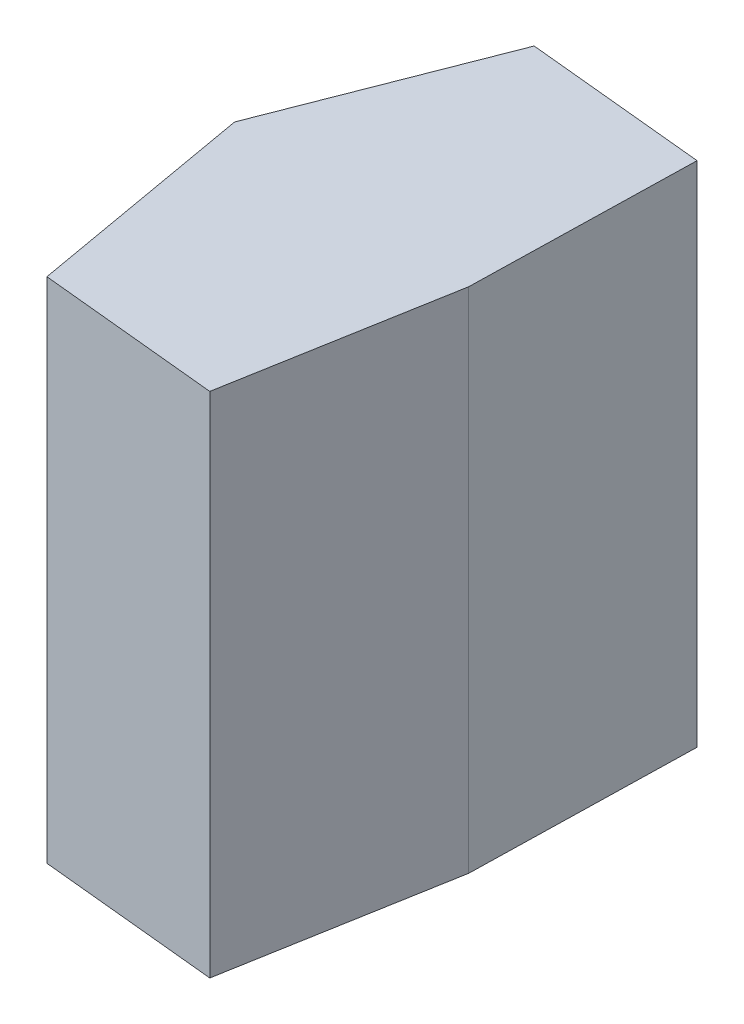
ISO-10303-21;
HEADER;
FILE_DESCRIPTION(('STEP AP214'),'2;1');
FILE_NAME('part.step','',(''),(''),'','','');
FILE_SCHEMA(('AUTOMOTIVE_DESIGN { 1 0 10303 214 1 1 1 1 }'));
ENDSEC;
DATA;
#1=APPLICATION_CONTEXT('core data for automotive mechanical design processes');
#2=APPLICATION_PROTOCOL_DEFINITION('international standard','automotive_design',2000,#1);
#3=PRODUCT_CONTEXT('',#1,'mechanical');
#4=PRODUCT('Part','Part','',(#3));
#5=PRODUCT_RELATED_PRODUCT_CATEGORY('part','',(#4));
#6=PRODUCT_DEFINITION_FORMATION('','',#4);
#7=PRODUCT_DEFINITION_CONTEXT('part definition',#1,'design');
#8=PRODUCT_DEFINITION('design','',#6,#7);
#9=PRODUCT_DEFINITION_SHAPE('','',#8);
#10=(LENGTH_UNIT() NAMED_UNIT(*) SI_UNIT(.MILLI.,.METRE.));
#11=(NAMED_UNIT(*) PLANE_ANGLE_UNIT() SI_UNIT($,.RADIAN.));
#12=(NAMED_UNIT(*) SI_UNIT($,.STERADIAN.) SOLID_ANGLE_UNIT());
#13=UNCERTAINTY_MEASURE_WITH_UNIT(LENGTH_MEASURE(1.E-05),#10,'distance_accuracy_value','');
#14=(GEOMETRIC_REPRESENTATION_CONTEXT(3) GLOBAL_UNCERTAINTY_ASSIGNED_CONTEXT((#13)) GLOBAL_UNIT_ASSIGNED_CONTEXT((#10,
#11,#12)) REPRESENTATION_CONTEXT('',''));
#15=CARTESIAN_POINT('',(0.,0.,0.));
#16=DIRECTION('',(0.,0.,1.));
#17=DIRECTION('',(1.,0.,0.));
#18=AXIS2_PLACEMENT_3D('',#15,#16,#17);
#19=CARTESIAN_POINT('',(2.27222589262074,6.5,-12.8864333948838));
#20=DIRECTION('',(-0.984807753012206,0.,-0.17364817766694));
#21=DIRECTION('',(-0.17364817766694,0.,0.984807753012206));
#22=AXIS2_PLACEMENT_3D('',#19,#20,#21);
#23=PLANE('',#22);
#24=DIRECTION('',(0.17364817766694,0.,-0.984807753012206));
#25=VECTOR('',#24,1.);
#26=CARTESIAN_POINT('',(2.27222589262074,-6.5,-12.8864333948838));
#27=LINE('',#26,#25);
#28=CARTESIAN_POINT('',(2.27222589262074,-6.5,-12.8864333948838));
#29=VERTEX_POINT('',#28);
#30=CARTESIAN_POINT('',(3.26526789961103,-6.5,-18.5182544752442));
#31=VERTEX_POINT('',#30);
#32=EDGE_CURVE('E134',#29,#31,#27,.T.);
#33=ORIENTED_EDGE('',*,*,#32,.T.);
#34=DIRECTION('',(0.,-1.,0.));
#35=VECTOR('',#34,1.);
#36=CARTESIAN_POINT('',(3.26526789961103,6.5,-18.5182544752442));
#37=LINE('',#36,#35);
#38=CARTESIAN_POINT('',(3.26526789961103,6.5,-18.5182544752442));
#39=VERTEX_POINT('',#38);
#40=EDGE_CURVE('E131',#39,#31,#37,.T.);
#41=ORIENTED_EDGE('',*,*,#40,.F.);
#42=DIRECTION('',(0.17364817766694,0.,-0.984807753012206));
#43=VECTOR('',#42,1.);
#44=CARTESIAN_POINT('',(2.27222589262074,6.5,-12.8864333948838));
#45=LINE('',#44,#43);
#46=CARTESIAN_POINT('',(2.27222589262074,6.5,-12.8864333948838));
#47=VERTEX_POINT('',#46);
#48=EDGE_CURVE('E79',#47,#39,#45,.T.);
#49=ORIENTED_EDGE('',*,*,#48,.F.);
#50=DIRECTION('',(0.,-1.,0.));
#51=VECTOR('',#50,1.);
#52=CARTESIAN_POINT('',(2.27222589262074,6.5,-12.8864333948838));
#53=LINE('',#52,#51);
#54=EDGE_CURVE('E47',#47,#29,#53,.T.);
#55=ORIENTED_EDGE('',*,*,#54,.T.);
#56=EDGE_LOOP('',(#33,#41,#49,#55));
#57=FACE_BOUND('',#56,.T.);
#58=ADVANCED_FACE('F39',(#57),#23,.F.);
#59=CARTESIAN_POINT('',(-3.3810821421355,6.5,-19.1750696833283));
#60=DIRECTION('',(0.98480775301221,0.,-0.17364817766692));
#61=DIRECTION('',(-0.17364817766692,0.,-0.98480775301221));
#62=AXIS2_PLACEMENT_3D('',#59,#60,#61);
#63=PLANE('',#62);
#64=DIRECTION('',(0.17364817766692,0.,0.98480775301221));
#65=VECTOR('',#64,1.);
#66=CARTESIAN_POINT('',(-3.3810821421355,-6.5,-19.1750696833283));
#67=LINE('',#66,#65);
#68=CARTESIAN_POINT('',(-3.3810821421355,-6.5,-19.1750696833283));
#69=VERTEX_POINT('',#68);
#70=CARTESIAN_POINT('',(-2.35294288432885,-6.5,-13.3442022024938));
#71=VERTEX_POINT('',#70);
#72=EDGE_CURVE('E69',#69,#71,#67,.T.);
#73=ORIENTED_EDGE('',*,*,#72,.T.);
#74=DIRECTION('',(0.,-1.,0.));
#75=VECTOR('',#74,1.);
#76=CARTESIAN_POINT('',(-2.35294288432885,6.5,-13.3442022024938));
#77=LINE('',#76,#75);
#78=CARTESIAN_POINT('',(-2.35294288432885,6.5,-13.3442022024938));
#79=VERTEX_POINT('',#78);
#80=EDGE_CURVE('E11',#79,#71,#77,.T.);
#81=ORIENTED_EDGE('',*,*,#80,.F.);
#82=DIRECTION('',(0.17364817766692,0.,0.98480775301221));
#83=VECTOR('',#82,1.);
#84=CARTESIAN_POINT('',(-3.3810821421355,6.5,-19.1750696833283));
#85=LINE('',#84,#83);
#86=CARTESIAN_POINT('',(-3.3810821421355,6.5,-19.1750696833283));
#87=VERTEX_POINT('',#86);
#88=EDGE_CURVE('E136',#87,#79,#85,.T.);
#89=ORIENTED_EDGE('',*,*,#88,.F.);
#90=DIRECTION('',(0.,-1.,0.));
#91=VECTOR('',#90,1.);
#92=CARTESIAN_POINT('',(-3.3810821421355,6.5,-19.1750696833283));
#93=LINE('',#92,#91);
#94=EDGE_CURVE('E117',#87,#69,#93,.T.);
#95=ORIENTED_EDGE('',*,*,#94,.T.);
#96=EDGE_LOOP('',(#73,#81,#89,#95));
#97=FACE_BOUND('',#96,.T.);
#98=ADVANCED_FACE('F159',(#97),#63,.F.);
#99=CARTESIAN_POINT('',(-2.35294288432885,6.5,-13.3442022024938));
#100=DIRECTION('',(0.0984922013654337,0.,-0.995137822751297));
#101=DIRECTION('',(-0.995137822751297,0.,-0.0984922013654337));
#102=AXIS2_PLACEMENT_3D('',#99,#100,#101);
#103=PLANE('',#102);
#104=DIRECTION('',(0.995137822751297,0.,0.0984922013654337));
#105=VECTOR('',#104,1.);
#106=CARTESIAN_POINT('',(-2.35294288432885,-6.5,-13.3442022024938));
#107=LINE('',#106,#105);
#108=EDGE_CURVE('E74',#71,#29,#107,.T.);
#109=ORIENTED_EDGE('',*,*,#108,.T.);
#110=ORIENTED_EDGE('',*,*,#54,.F.);
#111=DIRECTION('',(0.995137822751297,0.,0.0984922013654337));
#112=VECTOR('',#111,1.);
#113=CARTESIAN_POINT('',(-2.35294288432885,6.5,-13.3442022024938));
#114=LINE('',#113,#112);
#115=EDGE_CURVE('E55',#79,#47,#114,.T.);
#116=ORIENTED_EDGE('',*,*,#115,.F.);
#117=ORIENTED_EDGE('',*,*,#80,.T.);
#118=EDGE_LOOP('',(#109,#110,#116,#117));
#119=FACE_BOUND('',#118,.T.);
#120=ADVANCED_FACE('F164',(#119),#103,.F.);
#121=CARTESIAN_POINT('',(0.,6.5,0.));
#122=DIRECTION('',(0.,-1.,0.));
#123=DIRECTION('',(0.,0.,-1.));
#124=AXIS2_PLACEMENT_3D('',#121,#122,#123);
#125=PLANE('',#124);
#126=ORIENTED_EDGE('',*,*,#48,.T.);
#127=DIRECTION('',(-0.022472405716165,0.,0.999747463603348));
#128=VECTOR('',#127,1.);
#129=CARTESIAN_POINT('',(3.39378086861599,6.5,-24.2355112934776));
#130=LINE('',#129,#128);
#131=CARTESIAN_POINT('',(3.39378086861599,6.5,-24.2355112934776));
#132=VERTEX_POINT('',#131);
#133=EDGE_CURVE('E104',#132,#39,#130,.T.);
#134=ORIENTED_EDGE('',*,*,#133,.F.);
#135=DIRECTION('',(0.995167036919666,0.,0.098196581552172));
#136=VECTOR('',#135,1.);
#137=CARTESIAN_POINT('',(-1.23152368898256,6.5,-24.6919061290619));
#138=LINE('',#137,#136);
#139=CARTESIAN_POINT('',(-1.23152368898256,6.5,-24.6919061290619));
#140=VERTEX_POINT('',#139);
#141=EDGE_CURVE('E97',#140,#132,#138,.T.);
#142=ORIENTED_EDGE('',*,*,#141,.F.);
#143=DIRECTION('',(0.363050924613878,0.,-0.93176929877358));
#144=VECTOR('',#143,1.);
#145=CARTESIAN_POINT('',(-3.3810821421355,6.5,-19.1750696833283));
#146=LINE('',#145,#144);
#147=EDGE_CURVE('E101',#87,#140,#146,.T.);
#148=ORIENTED_EDGE('',*,*,#147,.F.);
#149=ORIENTED_EDGE('',*,*,#88,.T.);
#150=ORIENTED_EDGE('',*,*,#115,.T.);
#151=EDGE_LOOP('',(#126,#134,#142,#148,#149,#150));
#152=FACE_BOUND('',#151,.T.);
#153=ADVANCED_FACE('F99',(#152),#125,.F.);
#154=CARTESIAN_POINT('',(0.,-6.5,0.));
#155=DIRECTION('',(0.,-1.,0.));
#156=DIRECTION('',(0.,0.,-1.));
#157=AXIS2_PLACEMENT_3D('',#154,#155,#156);
#158=PLANE('',#157);
#159=ORIENTED_EDGE('',*,*,#32,.F.);
#160=ORIENTED_EDGE('',*,*,#108,.F.);
#161=ORIENTED_EDGE('',*,*,#72,.F.);
#162=DIRECTION('',(0.363050924613878,0.,-0.93176929877358));
#163=VECTOR('',#162,1.);
#164=CARTESIAN_POINT('',(-3.3810821421355,-6.5,-19.1750696833283));
#165=LINE('',#164,#163);
#166=CARTESIAN_POINT('',(-1.23152368898256,-6.5,-24.6919061290619));
#167=VERTEX_POINT('',#166);
#168=EDGE_CURVE('E126',#69,#167,#165,.T.);
#169=ORIENTED_EDGE('',*,*,#168,.T.);
#170=DIRECTION('',(0.995167036919666,0.,0.098196581552172));
#171=VECTOR('',#170,1.);
#172=CARTESIAN_POINT('',(-1.23152368898256,-6.5,-24.6919061290619));
#173=LINE('',#172,#171);
#174=CARTESIAN_POINT('',(3.39378086861599,-6.5,-24.2355112934776));
#175=VERTEX_POINT('',#174);
#176=EDGE_CURVE('E113',#167,#175,#173,.T.);
#177=ORIENTED_EDGE('',*,*,#176,.T.);
#178=DIRECTION('',(-0.022472405716165,0.,0.999747463603348));
#179=VECTOR('',#178,1.);
#180=CARTESIAN_POINT('',(3.39378086861599,-6.5,-24.2355112934776));
#181=LINE('',#180,#179);
#182=EDGE_CURVE('E123',#175,#31,#181,.T.);
#183=ORIENTED_EDGE('',*,*,#182,.T.);
#184=EDGE_LOOP('',(#159,#160,#161,#169,#177,#183));
#185=FACE_BOUND('',#184,.T.);
#186=ADVANCED_FACE('F144',(#185),#158,.T.);
#187=CARTESIAN_POINT('',(3.39378086861599,6.5,-24.2355112934776));
#188=DIRECTION('',(-0.999747463603348,0.,-0.022472405716165));
#189=DIRECTION('',(0.022472405716165,0.,-0.999747463603348));
#190=AXIS2_PLACEMENT_3D('',#187,#188,#189);
#191=PLANE('',#190);
#192=ORIENTED_EDGE('',*,*,#182,.F.);
#193=DIRECTION('',(0.,-1.,0.));
#194=VECTOR('',#193,1.);
#195=CARTESIAN_POINT('',(3.39378086861599,6.5,-24.2355112934776));
#196=LINE('',#195,#194);
#197=EDGE_CURVE('E108',#132,#175,#196,.T.);
#198=ORIENTED_EDGE('',*,*,#197,.F.);
#199=ORIENTED_EDGE('',*,*,#133,.T.);
#200=ORIENTED_EDGE('',*,*,#40,.T.);
#201=EDGE_LOOP('',(#192,#198,#199,#200));
#202=FACE_BOUND('',#201,.T.);
#203=ADVANCED_FACE('F147',(#202),#191,.F.);
#204=CARTESIAN_POINT('',(-3.3810821421355,6.5,-19.1750696833283));
#205=DIRECTION('',(0.93176929877358,0.,0.363050924613878));
#206=DIRECTION('',(-0.363050924613878,0.,0.93176929877358));
#207=AXIS2_PLACEMENT_3D('',#204,#205,#206);
#208=PLANE('',#207);
#209=ORIENTED_EDGE('',*,*,#168,.F.);
#210=ORIENTED_EDGE('',*,*,#94,.F.);
#211=ORIENTED_EDGE('',*,*,#147,.T.);
#212=DIRECTION('',(0.,-1.,0.));
#213=VECTOR('',#212,1.);
#214=CARTESIAN_POINT('',(-1.23152368898256,6.5,-24.6919061290619));
#215=LINE('',#214,#213);
#216=EDGE_CURVE('E111',#140,#167,#215,.T.);
#217=ORIENTED_EDGE('',*,*,#216,.T.);
#218=EDGE_LOOP('',(#209,#210,#211,#217));
#219=FACE_BOUND('',#218,.T.);
#220=ADVANCED_FACE('F119',(#219),#208,.F.);
#221=CARTESIAN_POINT('',(-1.23152368898256,6.5,-24.6919061290619));
#222=DIRECTION('',(-0.0981965815521721,0.,0.995167036919666));
#223=DIRECTION('',(-0.995167036919666,0.,-0.098196581552172));
#224=AXIS2_PLACEMENT_3D('',#221,#222,#223);
#225=PLANE('',#224);
#226=ORIENTED_EDGE('',*,*,#176,.F.);
#227=ORIENTED_EDGE('',*,*,#216,.F.);
#228=ORIENTED_EDGE('',*,*,#141,.T.);
#229=ORIENTED_EDGE('',*,*,#197,.T.);
#230=EDGE_LOOP('',(#226,#227,#228,#229));
#231=FACE_BOUND('',#230,.T.);
#232=ADVANCED_FACE('F112',(#231),#225,.F.);
#233=CLOSED_SHELL('',(#58,#98,#120,#153,#186,#203,#220,#232));
#234=MANIFOLD_SOLID_BREP('B2',#233);
#235=ADVANCED_BREP_SHAPE_REPRESENTATION('',(#18,#234),#14);
#236=SHAPE_DEFINITION_REPRESENTATION(#9,#235);
ENDSEC;
END-ISO-10303-21;
